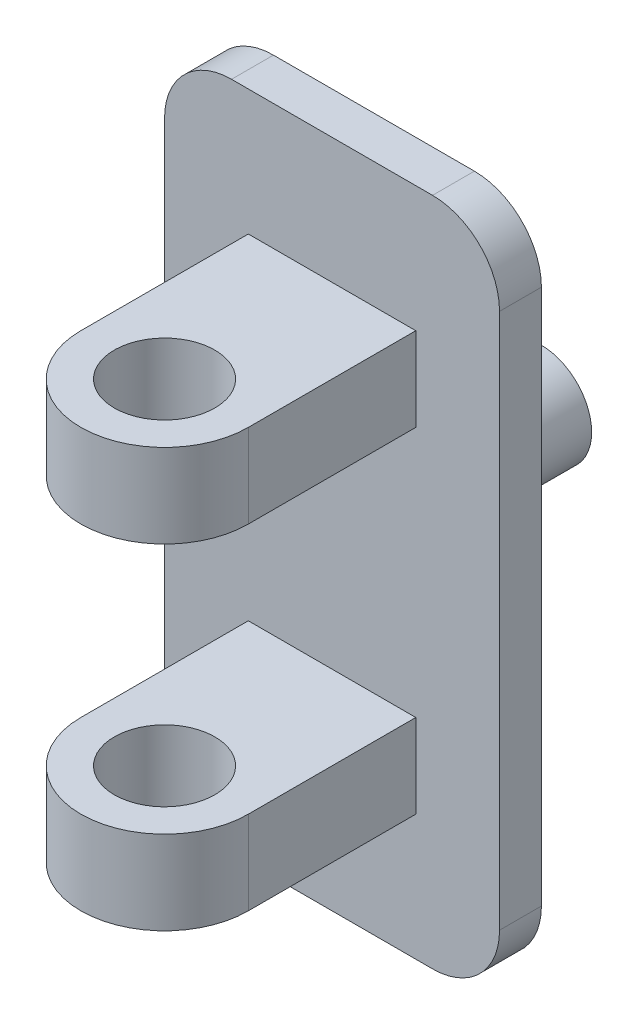
ISO-10303-21;
HEADER;
FILE_DESCRIPTION(('STEP AP214'),'2;1');
FILE_NAME('part.step','',(''),(''),'','','');
FILE_SCHEMA(('AUTOMOTIVE_DESIGN { 1 0 10303 214 1 1 1 1 }'));
ENDSEC;
DATA;
#1=APPLICATION_CONTEXT('core data for automotive mechanical design processes');
#2=APPLICATION_PROTOCOL_DEFINITION('international standard','automotive_design',2000,#1);
#3=PRODUCT_CONTEXT('',#1,'mechanical');
#4=PRODUCT('Part','Part','',(#3));
#5=PRODUCT_RELATED_PRODUCT_CATEGORY('part','',(#4));
#6=PRODUCT_DEFINITION_FORMATION('','',#4);
#7=PRODUCT_DEFINITION_CONTEXT('part definition',#1,'design');
#8=PRODUCT_DEFINITION('design','',#6,#7);
#9=PRODUCT_DEFINITION_SHAPE('','',#8);
#10=(LENGTH_UNIT() NAMED_UNIT(*) SI_UNIT(.MILLI.,.METRE.));
#11=(NAMED_UNIT(*) PLANE_ANGLE_UNIT() SI_UNIT($,.RADIAN.));
#12=(NAMED_UNIT(*) SI_UNIT($,.STERADIAN.) SOLID_ANGLE_UNIT());
#13=UNCERTAINTY_MEASURE_WITH_UNIT(LENGTH_MEASURE(1.E-05),#10,'distance_accuracy_value','');
#14=(GEOMETRIC_REPRESENTATION_CONTEXT(3) GLOBAL_UNCERTAINTY_ASSIGNED_CONTEXT((#13)) GLOBAL_UNIT_ASSIGNED_CONTEXT((#10,
#11,#12)) REPRESENTATION_CONTEXT('',''));
#15=CARTESIAN_POINT('',(0.,0.,0.));
#16=DIRECTION('',(0.,0.,1.));
#17=DIRECTION('',(1.,0.,0.));
#18=AXIS2_PLACEMENT_3D('',#15,#16,#17);
#19=CARTESIAN_POINT('',(0.,0.,4.7625));
#20=DIRECTION('',(0.,0.,-1.));
#21=DIRECTION('',(-1.,0.,0.));
#22=AXIS2_PLACEMENT_3D('',#19,#20,#21);
#23=PLANE('',#22);
#24=DIRECTION('',(0.,1.,0.));
#25=VECTOR('',#24,1.);
#26=CARTESIAN_POINT('',(3.175,-7.9375,4.7625));
#27=LINE('',#26,#25);
#28=CARTESIAN_POINT('',(3.175,-7.9375,4.7625));
#29=VERTEX_POINT('',#28);
#30=CARTESIAN_POINT('',(3.175,-4.7625,4.7625));
#31=VERTEX_POINT('',#30);
#32=EDGE_CURVE('E171',#29,#31,#27,.T.);
#33=ORIENTED_EDGE('',*,*,#32,.F.);
#34=DIRECTION('',(-1.,0.,0.));
#35=VECTOR('',#34,1.);
#36=CARTESIAN_POINT('',(-3.175,-7.9375,4.7625));
#37=LINE('',#36,#35);
#38=CARTESIAN_POINT('',(-3.175,-7.9375,4.7625));
#39=VERTEX_POINT('',#38);
#40=EDGE_CURVE('E180',#29,#39,#37,.T.);
#41=ORIENTED_EDGE('',*,*,#40,.T.);
#42=DIRECTION('',(0.,1.,0.));
#43=VECTOR('',#42,1.);
#44=CARTESIAN_POINT('',(-3.175,-7.9375,4.7625));
#45=LINE('',#44,#43);
#46=CARTESIAN_POINT('',(-3.175,-4.7625,4.7625));
#47=VERTEX_POINT('',#46);
#48=EDGE_CURVE('E208',#39,#47,#45,.T.);
#49=ORIENTED_EDGE('',*,*,#48,.T.);
#50=DIRECTION('',(-1.,0.,0.));
#51=VECTOR('',#50,1.);
#52=CARTESIAN_POINT('',(-3.175,-4.7625,4.7625));
#53=LINE('',#52,#51);
#54=EDGE_CURVE('E195',#31,#47,#53,.T.);
#55=ORIENTED_EDGE('',*,*,#54,.F.);
#56=EDGE_LOOP('',(#33,#41,#49,#55));
#57=FACE_BOUND('',#56,.T.);
#58=DIRECTION('',(0.,1.,0.));
#59=VECTOR('',#58,1.);
#60=CARTESIAN_POINT('',(6.35,-12.7,4.7625));
#61=LINE('',#60,#59);
#62=CARTESIAN_POINT('',(6.35,-10.16,4.7625));
#63=VERTEX_POINT('',#62);
#64=CARTESIAN_POINT('',(6.35,10.16,4.7625));
#65=VERTEX_POINT('',#64);
#66=EDGE_CURVE('E264',#63,#65,#61,.T.);
#67=ORIENTED_EDGE('',*,*,#66,.T.);
#68=CARTESIAN_POINT('',(3.81,10.16,4.7625));
#69=DIRECTION('',(0.,0.,-1.));
#70=DIRECTION('',(-1.,0.,0.));
#71=AXIS2_PLACEMENT_3D('',#68,#69,#70);
#72=CIRCLE('',#71,2.54);
#73=CARTESIAN_POINT('',(3.81,12.7,4.7625));
#74=VERTEX_POINT('',#73);
#75=EDGE_CURVE('E334',#65,#74,#72,.F.);
#76=ORIENTED_EDGE('',*,*,#75,.T.);
#77=DIRECTION('',(-1.,0.,0.));
#78=VECTOR('',#77,1.);
#79=CARTESIAN_POINT('',(-6.35,12.7,4.7625));
#80=LINE('',#79,#78);
#81=CARTESIAN_POINT('',(-3.81,12.7,4.7625));
#82=VERTEX_POINT('',#81);
#83=EDGE_CURVE('E268',#74,#82,#80,.T.);
#84=ORIENTED_EDGE('',*,*,#83,.T.);
#85=CARTESIAN_POINT('',(-3.81,10.16,4.7625));
#86=DIRECTION('',(0.,0.,-1.));
#87=DIRECTION('',(-1.,0.,0.));
#88=AXIS2_PLACEMENT_3D('',#85,#86,#87);
#89=CIRCLE('',#88,2.54);
#90=CARTESIAN_POINT('',(-6.35,10.16,4.7625));
#91=VERTEX_POINT('',#90);
#92=EDGE_CURVE('E326',#82,#91,#89,.F.);
#93=ORIENTED_EDGE('',*,*,#92,.T.);
#94=DIRECTION('',(0.,-1.,0.));
#95=VECTOR('',#94,1.);
#96=CARTESIAN_POINT('',(-6.35,-12.7,4.7625));
#97=LINE('',#96,#95);
#98=CARTESIAN_POINT('',(-6.35,-10.16,4.7625));
#99=VERTEX_POINT('',#98);
#100=EDGE_CURVE('E273',#91,#99,#97,.T.);
#101=ORIENTED_EDGE('',*,*,#100,.T.);
#102=CARTESIAN_POINT('',(-3.81,-10.16,4.7625));
#103=DIRECTION('',(0.,0.,-1.));
#104=DIRECTION('',(-1.,0.,0.));
#105=AXIS2_PLACEMENT_3D('',#102,#103,#104);
#106=CIRCLE('',#105,2.54);
#107=CARTESIAN_POINT('',(-3.81,-12.7,4.7625));
#108=VERTEX_POINT('',#107);
#109=EDGE_CURVE('E67',#99,#108,#106,.F.);
#110=ORIENTED_EDGE('',*,*,#109,.T.);
#111=DIRECTION('',(1.,0.,0.));
#112=VECTOR('',#111,1.);
#113=CARTESIAN_POINT('',(-6.35,-12.7,4.7625));
#114=LINE('',#113,#112);
#115=CARTESIAN_POINT('',(3.81,-12.7,4.7625));
#116=VERTEX_POINT('',#115);
#117=EDGE_CURVE('E276',#108,#116,#114,.T.);
#118=ORIENTED_EDGE('',*,*,#117,.T.);
#119=CARTESIAN_POINT('',(3.81,-10.16,4.7625));
#120=DIRECTION('',(0.,0.,-1.));
#121=DIRECTION('',(-1.,0.,0.));
#122=AXIS2_PLACEMENT_3D('',#119,#120,#121);
#123=CIRCLE('',#122,2.54);
#124=EDGE_CURVE('E331',#116,#63,#123,.F.);
#125=ORIENTED_EDGE('',*,*,#124,.T.);
#126=EDGE_LOOP('',(#67,#76,#84,#93,#101,#110,#118,#125));
#127=FACE_BOUND('',#126,.T.);
#128=DIRECTION('',(0.,-1.,0.));
#129=VECTOR('',#128,1.);
#130=CARTESIAN_POINT('',(-3.175,7.9375,4.7625));
#131=LINE('',#130,#129);
#132=CARTESIAN_POINT('',(-3.175,7.9375,4.7625));
#133=VERTEX_POINT('',#132);
#134=CARTESIAN_POINT('',(-3.175,4.7625,4.7625));
#135=VERTEX_POINT('',#134);
#136=EDGE_CURVE('E236',#133,#135,#131,.T.);
#137=ORIENTED_EDGE('',*,*,#136,.F.);
#138=DIRECTION('',(-1.,0.,0.));
#139=VECTOR('',#138,1.);
#140=CARTESIAN_POINT('',(-3.175,7.9375,4.7625));
#141=LINE('',#140,#139);
#142=CARTESIAN_POINT('',(3.175,7.9375,4.7625));
#143=VERTEX_POINT('',#142);
#144=EDGE_CURVE('E232',#143,#133,#141,.T.);
#145=ORIENTED_EDGE('',*,*,#144,.F.);
#146=DIRECTION('',(0.,-1.,0.));
#147=VECTOR('',#146,1.);
#148=CARTESIAN_POINT('',(3.175,7.9375,4.7625));
#149=LINE('',#148,#147);
#150=CARTESIAN_POINT('',(3.175,4.7625,4.7625));
#151=VERTEX_POINT('',#150);
#152=EDGE_CURVE('E252',#143,#151,#149,.T.);
#153=ORIENTED_EDGE('',*,*,#152,.T.);
#154=DIRECTION('',(-1.,0.,0.));
#155=VECTOR('',#154,1.);
#156=CARTESIAN_POINT('',(-3.175,4.7625,4.7625));
#157=LINE('',#156,#155);
#158=EDGE_CURVE('E225',#151,#135,#157,.T.);
#159=ORIENTED_EDGE('',*,*,#158,.T.);
#160=EDGE_LOOP('',(#137,#145,#153,#159));
#161=FACE_BOUND('',#160,.T.);
#162=ADVANCED_FACE('F44',(#57,#127,#161),#23,.F.);
#163=CARTESIAN_POINT('',(0.,0.,3.175));
#164=DIRECTION('',(0.,0.,-1.));
#165=DIRECTION('',(-1.,0.,0.));
#166=AXIS2_PLACEMENT_3D('',#163,#164,#165);
#167=CYLINDRICAL_SURFACE('',#166,1.905);
#168=CARTESIAN_POINT('',(0.,0.,3.175));
#169=DIRECTION('',(0.,0.,1.));
#170=DIRECTION('',(1.,0.,0.));
#171=AXIS2_PLACEMENT_3D('',#168,#169,#170);
#172=CIRCLE('',#171,1.905);
#173=CARTESIAN_POINT('',(1.905,0.,3.175));
#174=VERTEX_POINT('',#173);
#175=EDGE_CURVE('E293',#174,#174,#172,.T.);
#176=ORIENTED_EDGE('',*,*,#175,.F.);
#177=EDGE_LOOP('',(#176));
#178=FACE_BOUND('',#177,.T.);
#179=CARTESIAN_POINT('',(0.,0.,-3.175));
#180=DIRECTION('',(0.,0.,1.));
#181=DIRECTION('',(1.,0.,0.));
#182=AXIS2_PLACEMENT_3D('',#179,#180,#181);
#183=CIRCLE('',#182,1.905);
#184=CARTESIAN_POINT('',(1.905,0.,-3.175));
#185=VERTEX_POINT('',#184);
#186=EDGE_CURVE('E279',#185,#185,#183,.T.);
#187=ORIENTED_EDGE('',*,*,#186,.T.);
#188=EDGE_LOOP('',(#187));
#189=FACE_BOUND('',#188,.T.);
#190=ADVANCED_FACE('F383',(#178,#189),#167,.T.);
#191=CARTESIAN_POINT('',(0.,0.,-3.175));
#192=DIRECTION('',(0.,0.,1.));
#193=DIRECTION('',(1.,0.,0.));
#194=AXIS2_PLACEMENT_3D('',#191,#192,#193);
#195=PLANE('',#194);
#196=ORIENTED_EDGE('',*,*,#186,.F.);
#197=EDGE_LOOP('',(#196));
#198=FACE_BOUND('',#197,.T.);
#199=ADVANCED_FACE('F391',(#198),#195,.F.);
#200=CARTESIAN_POINT('',(6.35,-12.7,4.7625));
#201=DIRECTION('',(-1.,0.,0.));
#202=DIRECTION('',(0.,0.,1.));
#203=AXIS2_PLACEMENT_3D('',#200,#201,#202);
#204=PLANE('',#203);
#205=DIRECTION('',(0.,1.,0.));
#206=VECTOR('',#205,1.);
#207=CARTESIAN_POINT('',(6.35,-12.7,3.175));
#208=LINE('',#207,#206);
#209=CARTESIAN_POINT('',(6.35,-10.16,3.175));
#210=VERTEX_POINT('',#209);
#211=CARTESIAN_POINT('',(6.35,10.16,3.175));
#212=VERTEX_POINT('',#211);
#213=EDGE_CURVE('E263',#210,#212,#208,.T.);
#214=ORIENTED_EDGE('',*,*,#213,.T.);
#215=DIRECTION('',(0.,0.,-1.));
#216=VECTOR('',#215,1.);
#217=CARTESIAN_POINT('',(6.35,10.16,4.7625));
#218=LINE('',#217,#216);
#219=EDGE_CURVE('E323',#212,#65,#218,.F.);
#220=ORIENTED_EDGE('',*,*,#219,.T.);
#221=ORIENTED_EDGE('',*,*,#66,.F.);
#222=DIRECTION('',(0.,0.,-1.));
#223=VECTOR('',#222,1.);
#224=CARTESIAN_POINT('',(6.35,-10.16,4.7625));
#225=LINE('',#224,#223);
#226=EDGE_CURVE('E319',#63,#210,#225,.T.);
#227=ORIENTED_EDGE('',*,*,#226,.T.);
#228=EDGE_LOOP('',(#214,#220,#221,#227));
#229=FACE_BOUND('',#228,.T.);
#230=ADVANCED_FACE('F368',(#229),#204,.F.);
#231=CARTESIAN_POINT('',(-6.35,12.7,4.7625));
#232=DIRECTION('',(0.,-1.,0.));
#233=DIRECTION('',(0.,0.,-1.));
#234=AXIS2_PLACEMENT_3D('',#231,#232,#233);
#235=PLANE('',#234);
#236=ORIENTED_EDGE('',*,*,#83,.F.);
#237=DIRECTION('',(0.,0.,-1.));
#238=VECTOR('',#237,1.);
#239=CARTESIAN_POINT('',(3.81,12.7,4.7625));
#240=LINE('',#239,#238);
#241=CARTESIAN_POINT('',(3.81,12.7,3.175));
#242=VERTEX_POINT('',#241);
#243=EDGE_CURVE('E303',#74,#242,#240,.T.);
#244=ORIENTED_EDGE('',*,*,#243,.T.);
#245=DIRECTION('',(-1.,0.,0.));
#246=VECTOR('',#245,1.);
#247=CARTESIAN_POINT('',(-6.35,12.7,3.175));
#248=LINE('',#247,#246);
#249=CARTESIAN_POINT('',(-3.81,12.7,3.175));
#250=VERTEX_POINT('',#249);
#251=EDGE_CURVE('E283',#242,#250,#248,.T.);
#252=ORIENTED_EDGE('',*,*,#251,.T.);
#253=DIRECTION('',(0.,0.,-1.));
#254=VECTOR('',#253,1.);
#255=CARTESIAN_POINT('',(-3.81,12.7,4.7625));
#256=LINE('',#255,#254);
#257=EDGE_CURVE('E297',#250,#82,#256,.F.);
#258=ORIENTED_EDGE('',*,*,#257,.T.);
#259=EDGE_LOOP('',(#236,#244,#252,#258));
#260=FACE_BOUND('',#259,.T.);
#261=ADVANCED_FACE('F376',(#260),#235,.F.);
#262=CARTESIAN_POINT('',(-6.35,-12.7,4.7625));
#263=DIRECTION('',(1.,0.,0.));
#264=DIRECTION('',(0.,0.,-1.));
#265=AXIS2_PLACEMENT_3D('',#262,#263,#264);
#266=PLANE('',#265);
#267=DIRECTION('',(0.,-1.,0.));
#268=VECTOR('',#267,1.);
#269=CARTESIAN_POINT('',(-6.35,-12.7,3.175));
#270=LINE('',#269,#268);
#271=CARTESIAN_POINT('',(-6.35,10.16,3.175));
#272=VERTEX_POINT('',#271);
#273=CARTESIAN_POINT('',(-6.35,-10.16,3.175));
#274=VERTEX_POINT('',#273);
#275=EDGE_CURVE('E287',#272,#274,#270,.T.);
#276=ORIENTED_EDGE('',*,*,#275,.T.);
#277=DIRECTION('',(0.,0.,-1.));
#278=VECTOR('',#277,1.);
#279=CARTESIAN_POINT('',(-6.35,-10.16,4.7625));
#280=LINE('',#279,#278);
#281=EDGE_CURVE('E11',#274,#99,#280,.F.);
#282=ORIENTED_EDGE('',*,*,#281,.T.);
#283=ORIENTED_EDGE('',*,*,#100,.F.);
#284=DIRECTION('',(0.,0.,-1.));
#285=VECTOR('',#284,1.);
#286=CARTESIAN_POINT('',(-6.35,10.16,4.7625));
#287=LINE('',#286,#285);
#288=EDGE_CURVE('E53',#91,#272,#287,.T.);
#289=ORIENTED_EDGE('',*,*,#288,.T.);
#290=EDGE_LOOP('',(#276,#282,#283,#289));
#291=FACE_BOUND('',#290,.T.);
#292=ADVANCED_FACE('F348',(#291),#266,.F.);
#293=CARTESIAN_POINT('',(-6.35,-12.7,4.7625));
#294=DIRECTION('',(0.,1.,0.));
#295=DIRECTION('',(0.,0.,1.));
#296=AXIS2_PLACEMENT_3D('',#293,#294,#295);
#297=PLANE('',#296);
#298=DIRECTION('',(1.,0.,0.));
#299=VECTOR('',#298,1.);
#300=CARTESIAN_POINT('',(-6.35,-12.7,3.175));
#301=LINE('',#300,#299);
#302=CARTESIAN_POINT('',(-3.81,-12.7,3.175));
#303=VERTEX_POINT('',#302);
#304=CARTESIAN_POINT('',(3.81,-12.7,3.175));
#305=VERTEX_POINT('',#304);
#306=EDGE_CURVE('E269',#303,#305,#301,.T.);
#307=ORIENTED_EDGE('',*,*,#306,.T.);
#308=DIRECTION('',(0.,0.,-1.));
#309=VECTOR('',#308,1.);
#310=CARTESIAN_POINT('',(3.81,-12.7,4.7625));
#311=LINE('',#310,#309);
#312=EDGE_CURVE('E60',#305,#116,#311,.F.);
#313=ORIENTED_EDGE('',*,*,#312,.T.);
#314=ORIENTED_EDGE('',*,*,#117,.F.);
#315=DIRECTION('',(0.,0.,-1.));
#316=VECTOR('',#315,1.);
#317=CARTESIAN_POINT('',(-3.81,-12.7,4.7625));
#318=LINE('',#317,#316);
#319=EDGE_CURVE('E337',#108,#303,#318,.T.);
#320=ORIENTED_EDGE('',*,*,#319,.T.);
#321=EDGE_LOOP('',(#307,#313,#314,#320));
#322=FACE_BOUND('',#321,.T.);
#323=ADVANCED_FACE('F359',(#322),#297,.F.);
#324=CARTESIAN_POINT('',(0.,0.,3.175));
#325=DIRECTION('',(0.,0.,-1.));
#326=DIRECTION('',(-1.,0.,0.));
#327=AXIS2_PLACEMENT_3D('',#324,#325,#326);
#328=PLANE('',#327);
#329=ORIENTED_EDGE('',*,*,#175,.T.);
#330=EDGE_LOOP('',(#329));
#331=FACE_BOUND('',#330,.T.);
#332=ORIENTED_EDGE('',*,*,#251,.F.);
#333=CARTESIAN_POINT('',(3.81,10.16,3.175));
#334=DIRECTION('',(0.,0.,-1.));
#335=DIRECTION('',(-1.,0.,0.));
#336=AXIS2_PLACEMENT_3D('',#333,#334,#335);
#337=CIRCLE('',#336,2.54);
#338=EDGE_CURVE('E316',#242,#212,#337,.T.);
#339=ORIENTED_EDGE('',*,*,#338,.T.);
#340=ORIENTED_EDGE('',*,*,#213,.F.);
#341=CARTESIAN_POINT('',(3.81,-10.16,3.175));
#342=DIRECTION('',(0.,0.,-1.));
#343=DIRECTION('',(-1.,0.,0.));
#344=AXIS2_PLACEMENT_3D('',#341,#342,#343);
#345=CIRCLE('',#344,2.54);
#346=EDGE_CURVE('E313',#210,#305,#345,.T.);
#347=ORIENTED_EDGE('',*,*,#346,.T.);
#348=ORIENTED_EDGE('',*,*,#306,.F.);
#349=CARTESIAN_POINT('',(-3.81,-10.16,3.175));
#350=DIRECTION('',(0.,0.,-1.));
#351=DIRECTION('',(-1.,0.,0.));
#352=AXIS2_PLACEMENT_3D('',#349,#350,#351);
#353=CIRCLE('',#352,2.54);
#354=EDGE_CURVE('E310',#303,#274,#353,.T.);
#355=ORIENTED_EDGE('',*,*,#354,.T.);
#356=ORIENTED_EDGE('',*,*,#275,.F.);
#357=CARTESIAN_POINT('',(-3.81,10.16,3.175));
#358=DIRECTION('',(0.,0.,-1.));
#359=DIRECTION('',(-1.,0.,0.));
#360=AXIS2_PLACEMENT_3D('',#357,#358,#359);
#361=CIRCLE('',#360,2.54);
#362=EDGE_CURVE('E307',#272,#250,#361,.T.);
#363=ORIENTED_EDGE('',*,*,#362,.T.);
#364=EDGE_LOOP('',(#332,#339,#340,#347,#348,#355,#356,#363));
#365=FACE_BOUND('',#364,.T.);
#366=ADVANCED_FACE('F354',(#331,#365),#328,.T.);
#367=CARTESIAN_POINT('',(0.,7.9375,11.1125));
#368=DIRECTION('',(0.,1.,0.));
#369=DIRECTION('',(0.,0.,1.));
#370=AXIS2_PLACEMENT_3D('',#367,#368,#369);
#371=PLANE('',#370);
#372=DIRECTION('',(0.,0.,1.));
#373=VECTOR('',#372,1.);
#374=CARTESIAN_POINT('',(-3.175,7.9375,11.1125));
#375=LINE('',#374,#373);
#376=CARTESIAN_POINT('',(-3.175,7.9375,11.1125));
#377=VERTEX_POINT('',#376);
#378=EDGE_CURVE('E220',#133,#377,#375,.T.);
#379=ORIENTED_EDGE('',*,*,#378,.T.);
#380=CARTESIAN_POINT('',(0.,7.9375,11.1125));
#381=DIRECTION('',(0.,1.,0.));
#382=DIRECTION('',(0.,0.,1.));
#383=AXIS2_PLACEMENT_3D('',#380,#381,#382);
#384=CIRCLE('',#383,3.175);
#385=CARTESIAN_POINT('',(3.175,7.9375,11.1125));
#386=VERTEX_POINT('',#385);
#387=EDGE_CURVE('E224',#377,#386,#384,.T.);
#388=ORIENTED_EDGE('',*,*,#387,.T.);
#389=DIRECTION('',(0.,0.,-1.));
#390=VECTOR('',#389,1.);
#391=CARTESIAN_POINT('',(3.175,7.9375,4.7625));
#392=LINE('',#391,#390);
#393=EDGE_CURVE('E228',#386,#143,#392,.T.);
#394=ORIENTED_EDGE('',*,*,#393,.T.);
#395=ORIENTED_EDGE('',*,*,#144,.T.);
#396=EDGE_LOOP('',(#379,#388,#394,#395));
#397=FACE_BOUND('',#396,.T.);
#398=CARTESIAN_POINT('',(0.,7.9375,11.1125));
#399=DIRECTION('',(0.,1.,0.));
#400=DIRECTION('',(0.,0.,1.));
#401=AXIS2_PLACEMENT_3D('',#398,#399,#400);
#402=CIRCLE('',#401,1.905);
#403=CARTESIAN_POINT('',(0.,7.9375,13.0175));
#404=VERTEX_POINT('',#403);
#405=EDGE_CURVE('E212',#404,#404,#402,.T.);
#406=ORIENTED_EDGE('',*,*,#405,.F.);
#407=EDGE_LOOP('',(#406));
#408=FACE_BOUND('',#407,.T.);
#409=ADVANCED_FACE('F400',(#397,#408),#371,.T.);
#410=CARTESIAN_POINT('',(0.,4.7625,11.1125));
#411=DIRECTION('',(0.,1.,0.));
#412=DIRECTION('',(0.,0.,1.));
#413=AXIS2_PLACEMENT_3D('',#410,#411,#412);
#414=PLANE('',#413);
#415=DIRECTION('',(0.,0.,1.));
#416=VECTOR('',#415,1.);
#417=CARTESIAN_POINT('',(-3.175,4.7625,11.1125));
#418=LINE('',#417,#416);
#419=CARTESIAN_POINT('',(-3.175,4.7625,11.1125));
#420=VERTEX_POINT('',#419);
#421=EDGE_CURVE('E216',#135,#420,#418,.T.);
#422=ORIENTED_EDGE('',*,*,#421,.F.);
#423=ORIENTED_EDGE('',*,*,#158,.F.);
#424=DIRECTION('',(0.,0.,-1.));
#425=VECTOR('',#424,1.);
#426=CARTESIAN_POINT('',(3.175,4.7625,4.7625));
#427=LINE('',#426,#425);
#428=CARTESIAN_POINT('',(3.175,4.7625,11.1125));
#429=VERTEX_POINT('',#428);
#430=EDGE_CURVE('E243',#429,#151,#427,.T.);
#431=ORIENTED_EDGE('',*,*,#430,.F.);
#432=CARTESIAN_POINT('',(0.,4.7625,11.1125));
#433=DIRECTION('',(0.,1.,0.));
#434=DIRECTION('',(0.,0.,1.));
#435=AXIS2_PLACEMENT_3D('',#432,#433,#434);
#436=CIRCLE('',#435,3.175);
#437=EDGE_CURVE('E240',#420,#429,#436,.T.);
#438=ORIENTED_EDGE('',*,*,#437,.F.);
#439=EDGE_LOOP('',(#422,#423,#431,#438));
#440=FACE_BOUND('',#439,.T.);
#441=CARTESIAN_POINT('',(0.,4.7625,11.1125));
#442=DIRECTION('',(0.,1.,0.));
#443=DIRECTION('',(0.,0.,1.));
#444=AXIS2_PLACEMENT_3D('',#441,#442,#443);
#445=CIRCLE('',#444,1.905);
#446=CARTESIAN_POINT('',(0.,4.7625,13.0175));
#447=VERTEX_POINT('',#446);
#448=EDGE_CURVE('E211',#447,#447,#445,.T.);
#449=ORIENTED_EDGE('',*,*,#448,.T.);
#450=EDGE_LOOP('',(#449));
#451=FACE_BOUND('',#450,.T.);
#452=ADVANCED_FACE('F516',(#440,#451),#414,.F.);
#453=CARTESIAN_POINT('',(-3.175,7.9375,11.1125));
#454=DIRECTION('',(1.,0.,0.));
#455=DIRECTION('',(0.,0.,-1.));
#456=AXIS2_PLACEMENT_3D('',#453,#454,#455);
#457=PLANE('',#456);
#458=ORIENTED_EDGE('',*,*,#421,.T.);
#459=DIRECTION('',(0.,-1.,0.));
#460=VECTOR('',#459,1.);
#461=CARTESIAN_POINT('',(-3.175,7.9375,11.1125));
#462=LINE('',#461,#460);
#463=EDGE_CURVE('E259',#377,#420,#462,.T.);
#464=ORIENTED_EDGE('',*,*,#463,.F.);
#465=ORIENTED_EDGE('',*,*,#378,.F.);
#466=ORIENTED_EDGE('',*,*,#136,.T.);
#467=EDGE_LOOP('',(#458,#464,#465,#466));
#468=FACE_BOUND('',#467,.T.);
#469=ADVANCED_FACE('F396',(#468),#457,.F.);
#470=CARTESIAN_POINT('',(0.,7.9375,11.1125));
#471=DIRECTION('',(0.,-1.,0.));
#472=DIRECTION('',(0.,0.,-1.));
#473=AXIS2_PLACEMENT_3D('',#470,#471,#472);
#474=CYLINDRICAL_SURFACE('',#473,3.175);
#475=ORIENTED_EDGE('',*,*,#437,.T.);
#476=DIRECTION('',(0.,-1.,0.));
#477=VECTOR('',#476,1.);
#478=CARTESIAN_POINT('',(3.175,7.9375,11.1125));
#479=LINE('',#478,#477);
#480=EDGE_CURVE('E255',#386,#429,#479,.T.);
#481=ORIENTED_EDGE('',*,*,#480,.F.);
#482=ORIENTED_EDGE('',*,*,#387,.F.);
#483=ORIENTED_EDGE('',*,*,#463,.T.);
#484=EDGE_LOOP('',(#475,#481,#482,#483));
#485=FACE_BOUND('',#484,.T.);
#486=ADVANCED_FACE('F500',(#485),#474,.T.);
#487=CARTESIAN_POINT('',(3.175,7.9375,4.7625));
#488=DIRECTION('',(-1.,0.,0.));
#489=DIRECTION('',(0.,0.,1.));
#490=AXIS2_PLACEMENT_3D('',#487,#488,#489);
#491=PLANE('',#490);
#492=ORIENTED_EDGE('',*,*,#430,.T.);
#493=ORIENTED_EDGE('',*,*,#152,.F.);
#494=ORIENTED_EDGE('',*,*,#393,.F.);
#495=ORIENTED_EDGE('',*,*,#480,.T.);
#496=EDGE_LOOP('',(#492,#493,#494,#495));
#497=FACE_BOUND('',#496,.T.);
#498=ADVANCED_FACE('F491',(#497),#491,.F.);
#499=CARTESIAN_POINT('',(0.,7.9375,11.1125));
#500=DIRECTION('',(0.,-1.,0.));
#501=DIRECTION('',(0.,0.,-1.));
#502=AXIS2_PLACEMENT_3D('',#499,#500,#501);
#503=CYLINDRICAL_SURFACE('',#502,1.905);
#504=ORIENTED_EDGE('',*,*,#405,.T.);
#505=EDGE_LOOP('',(#504));
#506=FACE_BOUND('',#505,.T.);
#507=ORIENTED_EDGE('',*,*,#448,.F.);
#508=EDGE_LOOP('',(#507));
#509=FACE_BOUND('',#508,.T.);
#510=ADVANCED_FACE('F482',(#506,#509),#503,.F.);
#511=CARTESIAN_POINT('',(-3.175,-7.9375,11.1125));
#512=DIRECTION('',(-1.,0.,0.));
#513=DIRECTION('',(0.,0.,1.));
#514=AXIS2_PLACEMENT_3D('',#511,#512,#513);
#515=PLANE('',#514);
#516=DIRECTION('',(0.,0.,1.));
#517=VECTOR('',#516,1.);
#518=CARTESIAN_POINT('',(-3.175,-4.7625,11.1125));
#519=LINE('',#518,#517);
#520=CARTESIAN_POINT('',(-3.175,-4.7625,11.1125));
#521=VERTEX_POINT('',#520);
#522=EDGE_CURVE('E191',#47,#521,#519,.T.);
#523=ORIENTED_EDGE('',*,*,#522,.F.);
#524=ORIENTED_EDGE('',*,*,#48,.F.);
#525=DIRECTION('',(0.,0.,1.));
#526=VECTOR('',#525,1.);
#527=CARTESIAN_POINT('',(-3.175,-7.9375,11.1125));
#528=LINE('',#527,#526);
#529=CARTESIAN_POINT('',(-3.175,-7.9375,11.1125));
#530=VERTEX_POINT('',#529);
#531=EDGE_CURVE('E204',#39,#530,#528,.T.);
#532=ORIENTED_EDGE('',*,*,#531,.T.);
#533=DIRECTION('',(0.,1.,0.));
#534=VECTOR('',#533,1.);
#535=CARTESIAN_POINT('',(-3.175,-7.9375,11.1125));
#536=LINE('',#535,#534);
#537=EDGE_CURVE('E172',#530,#521,#536,.T.);
#538=ORIENTED_EDGE('',*,*,#537,.T.);
#539=EDGE_LOOP('',(#523,#524,#532,#538));
#540=FACE_BOUND('',#539,.T.);
#541=ADVANCED_FACE('F474',(#540),#515,.T.);
#542=CARTESIAN_POINT('',(3.175,-7.9375,4.7625));
#543=DIRECTION('',(1.,0.,0.));
#544=DIRECTION('',(0.,0.,-1.));
#545=AXIS2_PLACEMENT_3D('',#542,#543,#544);
#546=PLANE('',#545);
#547=DIRECTION('',(0.,0.,-1.));
#548=VECTOR('',#547,1.);
#549=CARTESIAN_POINT('',(3.175,-4.7625,4.7625));
#550=LINE('',#549,#548);
#551=CARTESIAN_POINT('',(3.175,-4.7625,11.1125));
#552=VERTEX_POINT('',#551);
#553=EDGE_CURVE('E165',#552,#31,#550,.T.);
#554=ORIENTED_EDGE('',*,*,#553,.F.);
#555=DIRECTION('',(0.,1.,0.));
#556=VECTOR('',#555,1.);
#557=CARTESIAN_POINT('',(3.175,-7.9375,11.1125));
#558=LINE('',#557,#556);
#559=CARTESIAN_POINT('',(3.175,-7.9375,11.1125));
#560=VERTEX_POINT('',#559);
#561=EDGE_CURVE('E159',#560,#552,#558,.T.);
#562=ORIENTED_EDGE('',*,*,#561,.F.);
#563=DIRECTION('',(0.,0.,-1.));
#564=VECTOR('',#563,1.);
#565=CARTESIAN_POINT('',(3.175,-7.9375,4.7625));
#566=LINE('',#565,#564);
#567=EDGE_CURVE('E163',#560,#29,#566,.T.);
#568=ORIENTED_EDGE('',*,*,#567,.T.);
#569=ORIENTED_EDGE('',*,*,#32,.T.);
#570=EDGE_LOOP('',(#554,#562,#568,#569));
#571=FACE_BOUND('',#570,.T.);
#572=ADVANCED_FACE('F161',(#571),#546,.T.);
#573=CARTESIAN_POINT('',(0.,-7.9375,11.1125));
#574=DIRECTION('',(0.,1.,0.));
#575=DIRECTION('',(0.,0.,1.));
#576=AXIS2_PLACEMENT_3D('',#573,#574,#575);
#577=CYLINDRICAL_SURFACE('',#576,3.175);
#578=CARTESIAN_POINT('',(0.,-4.7625,11.1125));
#579=DIRECTION('',(0.,1.,0.));
#580=DIRECTION('',(0.,0.,1.));
#581=AXIS2_PLACEMENT_3D('',#578,#579,#580);
#582=CIRCLE('',#581,3.175);
#583=EDGE_CURVE('E202',#521,#552,#582,.T.);
#584=ORIENTED_EDGE('',*,*,#583,.F.);
#585=ORIENTED_EDGE('',*,*,#537,.F.);
#586=CARTESIAN_POINT('',(0.,-7.9375,11.1125));
#587=DIRECTION('',(0.,1.,0.));
#588=DIRECTION('',(0.,0.,1.));
#589=AXIS2_PLACEMENT_3D('',#586,#587,#588);
#590=CIRCLE('',#589,3.175);
#591=EDGE_CURVE('E179',#530,#560,#590,.T.);
#592=ORIENTED_EDGE('',*,*,#591,.T.);
#593=ORIENTED_EDGE('',*,*,#561,.T.);
#594=EDGE_LOOP('',(#584,#585,#592,#593));
#595=FACE_BOUND('',#594,.T.);
#596=ADVANCED_FACE('F183',(#595),#577,.T.);
#597=CARTESIAN_POINT('',(0.,-7.9375,11.1125));
#598=DIRECTION('',(0.,-1.,0.));
#599=DIRECTION('',(0.,0.,1.));
#600=AXIS2_PLACEMENT_3D('',#597,#598,#599);
#601=PLANE('',#600);
#602=CARTESIAN_POINT('',(0.,-7.9375,11.1125));
#603=DIRECTION('',(0.,1.,0.));
#604=DIRECTION('',(0.,0.,1.));
#605=AXIS2_PLACEMENT_3D('',#602,#603,#604);
#606=CIRCLE('',#605,1.905);
#607=CARTESIAN_POINT('',(0.,-7.9375,13.0175));
#608=VERTEX_POINT('',#607);
#609=EDGE_CURVE('E196',#608,#608,#606,.T.);
#610=ORIENTED_EDGE('',*,*,#609,.T.);
#611=EDGE_LOOP('',(#610));
#612=FACE_BOUND('',#611,.T.);
#613=ORIENTED_EDGE('',*,*,#531,.F.);
#614=ORIENTED_EDGE('',*,*,#40,.F.);
#615=ORIENTED_EDGE('',*,*,#567,.F.);
#616=ORIENTED_EDGE('',*,*,#591,.F.);
#617=EDGE_LOOP('',(#613,#614,#615,#616));
#618=FACE_BOUND('',#617,.T.);
#619=ADVANCED_FACE('F178',(#612,#618),#601,.T.);
#620=CARTESIAN_POINT('',(0.,-4.7625,11.1125));
#621=DIRECTION('',(0.,-1.,0.));
#622=DIRECTION('',(0.,0.,1.));
#623=AXIS2_PLACEMENT_3D('',#620,#621,#622);
#624=PLANE('',#623);
#625=CARTESIAN_POINT('',(0.,-4.7625,11.1125));
#626=DIRECTION('',(0.,1.,0.));
#627=DIRECTION('',(0.,0.,1.));
#628=AXIS2_PLACEMENT_3D('',#625,#626,#627);
#629=CIRCLE('',#628,1.905);
#630=CARTESIAN_POINT('',(0.,-4.7625,13.0175));
#631=VERTEX_POINT('',#630);
#632=EDGE_CURVE('E613',#631,#631,#629,.T.);
#633=ORIENTED_EDGE('',*,*,#632,.F.);
#634=EDGE_LOOP('',(#633));
#635=FACE_BOUND('',#634,.T.);
#636=ORIENTED_EDGE('',*,*,#522,.T.);
#637=ORIENTED_EDGE('',*,*,#583,.T.);
#638=ORIENTED_EDGE('',*,*,#553,.T.);
#639=ORIENTED_EDGE('',*,*,#54,.T.);
#640=EDGE_LOOP('',(#636,#637,#638,#639));
#641=FACE_BOUND('',#640,.T.);
#642=ADVANCED_FACE('F442',(#635,#641),#624,.F.);
#643=CARTESIAN_POINT('',(0.,-7.9375,11.1125));
#644=DIRECTION('',(0.,1.,0.));
#645=DIRECTION('',(0.,0.,1.));
#646=AXIS2_PLACEMENT_3D('',#643,#644,#645);
#647=CYLINDRICAL_SURFACE('',#646,1.905);
#648=ORIENTED_EDGE('',*,*,#609,.F.);
#649=EDGE_LOOP('',(#648));
#650=FACE_BOUND('',#649,.T.);
#651=ORIENTED_EDGE('',*,*,#632,.T.);
#652=EDGE_LOOP('',(#651));
#653=FACE_BOUND('',#652,.T.);
#654=ADVANCED_FACE('F414',(#650,#653),#647,.F.);
#655=CARTESIAN_POINT('',(3.81,10.16,4.7625));
#656=DIRECTION('',(0.,0.,-1.));
#657=DIRECTION('',(-1.,0.,0.));
#658=AXIS2_PLACEMENT_3D('',#655,#656,#657);
#659=CYLINDRICAL_SURFACE('',#658,2.54);
#660=ORIENTED_EDGE('',*,*,#75,.F.);
#661=ORIENTED_EDGE('',*,*,#219,.F.);
#662=ORIENTED_EDGE('',*,*,#338,.F.);
#663=ORIENTED_EDGE('',*,*,#243,.F.);
#664=EDGE_LOOP('',(#660,#661,#662,#663));
#665=FACE_BOUND('',#664,.T.);
#666=ADVANCED_FACE('F373',(#665),#659,.T.);
#667=CARTESIAN_POINT('',(3.81,-10.16,4.7625));
#668=DIRECTION('',(0.,0.,-1.));
#669=DIRECTION('',(-1.,0.,0.));
#670=AXIS2_PLACEMENT_3D('',#667,#668,#669);
#671=CYLINDRICAL_SURFACE('',#670,2.54);
#672=ORIENTED_EDGE('',*,*,#124,.F.);
#673=ORIENTED_EDGE('',*,*,#312,.F.);
#674=ORIENTED_EDGE('',*,*,#346,.F.);
#675=ORIENTED_EDGE('',*,*,#226,.F.);
#676=EDGE_LOOP('',(#672,#673,#674,#675));
#677=FACE_BOUND('',#676,.T.);
#678=ADVANCED_FACE('F365',(#677),#671,.T.);
#679=CARTESIAN_POINT('',(-3.81,-10.16,4.7625));
#680=DIRECTION('',(0.,0.,-1.));
#681=DIRECTION('',(-1.,0.,0.));
#682=AXIS2_PLACEMENT_3D('',#679,#680,#681);
#683=CYLINDRICAL_SURFACE('',#682,2.54);
#684=ORIENTED_EDGE('',*,*,#109,.F.);
#685=ORIENTED_EDGE('',*,*,#281,.F.);
#686=ORIENTED_EDGE('',*,*,#354,.F.);
#687=ORIENTED_EDGE('',*,*,#319,.F.);
#688=EDGE_LOOP('',(#684,#685,#686,#687));
#689=FACE_BOUND('',#688,.T.);
#690=ADVANCED_FACE('F358',(#689),#683,.T.);
#691=CARTESIAN_POINT('',(-3.81,10.16,4.7625));
#692=DIRECTION('',(0.,0.,-1.));
#693=DIRECTION('',(-1.,0.,0.));
#694=AXIS2_PLACEMENT_3D('',#691,#692,#693);
#695=CYLINDRICAL_SURFACE('',#694,2.54);
#696=ORIENTED_EDGE('',*,*,#92,.F.);
#697=ORIENTED_EDGE('',*,*,#257,.F.);
#698=ORIENTED_EDGE('',*,*,#362,.F.);
#699=ORIENTED_EDGE('',*,*,#288,.F.);
#700=EDGE_LOOP('',(#696,#697,#698,#699));
#701=FACE_BOUND('',#700,.T.);
#702=ADVANCED_FACE('F46',(#701),#695,.T.);
#703=CLOSED_SHELL('',(#162,#190,#199,#230,#261,#292,#323,#366,#409,#452,#469,#486,#498,#510,
#541,#572,#596,#619,#642,#654,#666,#678,#690,#702));
#704=MANIFOLD_SOLID_BREP('B2',#703);
#705=ADVANCED_BREP_SHAPE_REPRESENTATION('',(#18,#704),#14);
#706=SHAPE_DEFINITION_REPRESENTATION(#9,#705);
ENDSEC;
END-ISO-10303-21;
